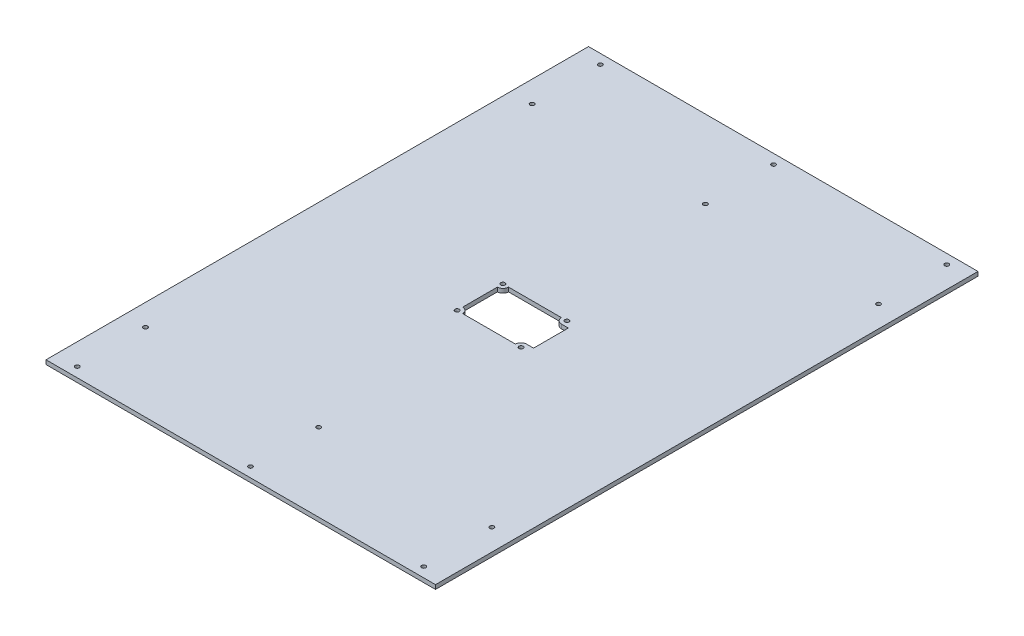
ISO-10303-21;
HEADER;
FILE_DESCRIPTION(('STEP AP214'),'2;1');
FILE_NAME('part.step','',(''),(''),'','','');
FILE_SCHEMA(('AUTOMOTIVE_DESIGN { 1 0 10303 214 1 1 1 1 }'));
ENDSEC;
DATA;
#1=APPLICATION_CONTEXT('core data for automotive mechanical design processes');
#2=APPLICATION_PROTOCOL_DEFINITION('international standard','automotive_design',2000,#1);
#3=PRODUCT_CONTEXT('',#1,'mechanical');
#4=PRODUCT('Part','Part','',(#3));
#5=PRODUCT_RELATED_PRODUCT_CATEGORY('part','',(#4));
#6=PRODUCT_DEFINITION_FORMATION('','',#4);
#7=PRODUCT_DEFINITION_CONTEXT('part definition',#1,'design');
#8=PRODUCT_DEFINITION('design','',#6,#7);
#9=PRODUCT_DEFINITION_SHAPE('','',#8);
#10=(LENGTH_UNIT() NAMED_UNIT(*) SI_UNIT(.MILLI.,.METRE.));
#11=(NAMED_UNIT(*) PLANE_ANGLE_UNIT() SI_UNIT($,.RADIAN.));
#12=(NAMED_UNIT(*) SI_UNIT($,.STERADIAN.) SOLID_ANGLE_UNIT());
#13=UNCERTAINTY_MEASURE_WITH_UNIT(LENGTH_MEASURE(1.E-05),#10,'distance_accuracy_value','');
#14=(GEOMETRIC_REPRESENTATION_CONTEXT(3) GLOBAL_UNCERTAINTY_ASSIGNED_CONTEXT((#13)) GLOBAL_UNIT_ASSIGNED_CONTEXT((#10,
#11,#12)) REPRESENTATION_CONTEXT('',''));
#15=CARTESIAN_POINT('',(0.,0.,0.));
#16=DIRECTION('',(0.,0.,1.));
#17=DIRECTION('',(1.,0.,0.));
#18=AXIS2_PLACEMENT_3D('',#15,#16,#17);
#19=CARTESIAN_POINT('',(0.,3.,0.));
#20=DIRECTION('',(1.,0.,0.));
#21=DIRECTION('',(0.,0.,-1.));
#22=AXIS2_PLACEMENT_3D('',#19,#20,#21);
#23=PLANE('',#22);
#24=DIRECTION('',(0.,0.,1.));
#25=VECTOR('',#24,1.);
#26=CARTESIAN_POINT('',(0.,0.,0.));
#27=LINE('',#26,#25);
#28=CARTESIAN_POINT('',(0.,0.,-390.));
#29=VERTEX_POINT('',#28);
#30=CARTESIAN_POINT('',(0.,0.,0.));
#31=VERTEX_POINT('',#30);
#32=EDGE_CURVE('E315',#29,#31,#27,.T.);
#33=ORIENTED_EDGE('',*,*,#32,.T.);
#34=DIRECTION('',(0.,-1.,0.));
#35=VECTOR('',#34,1.);
#36=CARTESIAN_POINT('',(0.,3.,0.));
#37=LINE('',#36,#35);
#38=CARTESIAN_POINT('',(0.,3.,0.));
#39=VERTEX_POINT('',#38);
#40=EDGE_CURVE('E11',#39,#31,#37,.T.);
#41=ORIENTED_EDGE('',*,*,#40,.F.);
#42=DIRECTION('',(0.,0.,1.));
#43=VECTOR('',#42,1.);
#44=CARTESIAN_POINT('',(0.,3.,0.));
#45=LINE('',#44,#43);
#46=CARTESIAN_POINT('',(0.,3.,-390.));
#47=VERTEX_POINT('',#46);
#48=EDGE_CURVE('E318',#47,#39,#45,.T.);
#49=ORIENTED_EDGE('',*,*,#48,.F.);
#50=DIRECTION('',(0.,-1.,0.));
#51=VECTOR('',#50,1.);
#52=CARTESIAN_POINT('',(0.,3.,-390.));
#53=LINE('',#52,#51);
#54=EDGE_CURVE('E328',#47,#29,#53,.T.);
#55=ORIENTED_EDGE('',*,*,#54,.T.);
#56=EDGE_LOOP('',(#33,#41,#49,#55));
#57=FACE_BOUND('',#56,.T.);
#58=ADVANCED_FACE('F34',(#57),#23,.F.);
#59=CARTESIAN_POINT('',(0.,3.,0.));
#60=DIRECTION('',(0.,0.,-1.));
#61=DIRECTION('',(-1.,0.,0.));
#62=AXIS2_PLACEMENT_3D('',#59,#60,#61);
#63=PLANE('',#62);
#64=DIRECTION('',(1.,0.,0.));
#65=VECTOR('',#64,1.);
#66=CARTESIAN_POINT('',(0.,0.,0.));
#67=LINE('',#66,#65);
#68=CARTESIAN_POINT('',(280.,0.,0.));
#69=VERTEX_POINT('',#68);
#70=EDGE_CURVE('E331',#31,#69,#67,.T.);
#71=ORIENTED_EDGE('',*,*,#70,.T.);
#72=DIRECTION('',(0.,-1.,0.));
#73=VECTOR('',#72,1.);
#74=CARTESIAN_POINT('',(280.,3.,0.));
#75=LINE('',#74,#73);
#76=CARTESIAN_POINT('',(280.,3.,0.));
#77=VERTEX_POINT('',#76);
#78=EDGE_CURVE('E41',#77,#69,#75,.T.);
#79=ORIENTED_EDGE('',*,*,#78,.F.);
#80=DIRECTION('',(1.,0.,0.));
#81=VECTOR('',#80,1.);
#82=CARTESIAN_POINT('',(0.,3.,0.));
#83=LINE('',#82,#81);
#84=EDGE_CURVE('E321',#39,#77,#83,.T.);
#85=ORIENTED_EDGE('',*,*,#84,.F.);
#86=ORIENTED_EDGE('',*,*,#40,.T.);
#87=EDGE_LOOP('',(#71,#79,#85,#86));
#88=FACE_BOUND('',#87,.T.);
#89=ADVANCED_FACE('F360',(#88),#63,.F.);
#90=CARTESIAN_POINT('',(280.,3.,0.));
#91=DIRECTION('',(-1.,0.,0.));
#92=DIRECTION('',(0.,0.,1.));
#93=AXIS2_PLACEMENT_3D('',#90,#91,#92);
#94=PLANE('',#93);
#95=DIRECTION('',(0.,0.,-1.));
#96=VECTOR('',#95,1.);
#97=CARTESIAN_POINT('',(280.,0.,0.));
#98=LINE('',#97,#96);
#99=CARTESIAN_POINT('',(280.,0.,-390.));
#100=VERTEX_POINT('',#99);
#101=EDGE_CURVE('E333',#69,#100,#98,.T.);
#102=ORIENTED_EDGE('',*,*,#101,.T.);
#103=DIRECTION('',(0.,-1.,0.));
#104=VECTOR('',#103,1.);
#105=CARTESIAN_POINT('',(280.,3.,-390.));
#106=LINE('',#105,#104);
#107=CARTESIAN_POINT('',(280.,3.,-390.));
#108=VERTEX_POINT('',#107);
#109=EDGE_CURVE('E338',#108,#100,#106,.T.);
#110=ORIENTED_EDGE('',*,*,#109,.F.);
#111=DIRECTION('',(0.,0.,-1.));
#112=VECTOR('',#111,1.);
#113=CARTESIAN_POINT('',(280.,3.,0.));
#114=LINE('',#113,#112);
#115=EDGE_CURVE('E324',#77,#108,#114,.T.);
#116=ORIENTED_EDGE('',*,*,#115,.F.);
#117=ORIENTED_EDGE('',*,*,#78,.T.);
#118=EDGE_LOOP('',(#102,#110,#116,#117));
#119=FACE_BOUND('',#118,.T.);
#120=ADVANCED_FACE('F345',(#119),#94,.F.);
#121=CARTESIAN_POINT('',(0.,3.,-390.));
#122=DIRECTION('',(0.,0.,1.));
#123=DIRECTION('',(1.,0.,0.));
#124=AXIS2_PLACEMENT_3D('',#121,#122,#123);
#125=PLANE('',#124);
#126=DIRECTION('',(-1.,0.,0.));
#127=VECTOR('',#126,1.);
#128=CARTESIAN_POINT('',(0.,0.,-390.));
#129=LINE('',#128,#127);
#130=EDGE_CURVE('E322',#100,#29,#129,.T.);
#131=ORIENTED_EDGE('',*,*,#130,.T.);
#132=ORIENTED_EDGE('',*,*,#54,.F.);
#133=DIRECTION('',(-1.,0.,0.));
#134=VECTOR('',#133,1.);
#135=CARTESIAN_POINT('',(0.,3.,-390.));
#136=LINE('',#135,#134);
#137=EDGE_CURVE('E326',#108,#47,#136,.T.);
#138=ORIENTED_EDGE('',*,*,#137,.F.);
#139=ORIENTED_EDGE('',*,*,#109,.T.);
#140=EDGE_LOOP('',(#131,#132,#138,#139));
#141=FACE_BOUND('',#140,.T.);
#142=ADVANCED_FACE('F353',(#141),#125,.F.);
#143=CARTESIAN_POINT('',(0.,3.,0.));
#144=DIRECTION('',(0.,-1.,0.));
#145=DIRECTION('',(0.,0.,-1.));
#146=AXIS2_PLACEMENT_3D('',#143,#144,#145);
#147=PLANE('',#146);
#148=CARTESIAN_POINT('',(163.,3.,-211.5));
#149=DIRECTION('',(0.,-1.,0.));
#150=DIRECTION('',(0.,0.,1.));
#151=AXIS2_PLACEMENT_3D('',#148,#149,#150);
#152=CIRCLE('',#151,4.);
#153=CARTESIAN_POINT('',(163.,3.,-207.5));
#154=VERTEX_POINT('',#153);
#155=CARTESIAN_POINT('',(159.,3.,-211.5));
#156=VERTEX_POINT('',#155);
#157=EDGE_CURVE('E48',#154,#156,#152,.T.);
#158=ORIENTED_EDGE('',*,*,#157,.F.);
#159=DIRECTION('',(-1.,0.,0.));
#160=VECTOR('',#159,1.);
#161=CARTESIAN_POINT('',(163.,3.,-207.5));
#162=LINE('',#161,#160);
#163=CARTESIAN_POINT('',(168.,3.,-207.5));
#164=VERTEX_POINT('',#163);
#165=EDGE_CURVE('E161',#164,#154,#162,.T.);
#166=ORIENTED_EDGE('',*,*,#165,.F.);
#167=DIRECTION('',(0.,0.,-1.));
#168=VECTOR('',#167,1.);
#169=CARTESIAN_POINT('',(168.,3.,-207.5));
#170=LINE('',#169,#168);
#171=CARTESIAN_POINT('',(168.,3.,-182.5));
#172=VERTEX_POINT('',#171);
#173=EDGE_CURVE('E163',#172,#164,#170,.T.);
#174=ORIENTED_EDGE('',*,*,#173,.F.);
#175=DIRECTION('',(1.,0.,0.));
#176=VECTOR('',#175,1.);
#177=CARTESIAN_POINT('',(163.,3.,-182.5));
#178=LINE('',#177,#176);
#179=CARTESIAN_POINT('',(163.,3.,-182.5));
#180=VERTEX_POINT('',#179);
#181=EDGE_CURVE('E141',#180,#172,#178,.T.);
#182=ORIENTED_EDGE('',*,*,#181,.F.);
#183=CARTESIAN_POINT('',(163.,3.,-178.5));
#184=DIRECTION('',(0.,-1.,0.));
#185=DIRECTION('',(0.,0.,1.));
#186=AXIS2_PLACEMENT_3D('',#183,#184,#185);
#187=CIRCLE('',#186,4.);
#188=CARTESIAN_POINT('',(159.,3.,-178.5));
#189=VERTEX_POINT('',#188);
#190=EDGE_CURVE('E174',#189,#180,#187,.T.);
#191=ORIENTED_EDGE('',*,*,#190,.F.);
#192=DIRECTION('',(1.,0.,0.));
#193=VECTOR('',#192,1.);
#194=CARTESIAN_POINT('',(159.,3.,-178.5));
#195=LINE('',#194,#193);
#196=CARTESIAN_POINT('',(121.,3.,-178.5));
#197=VERTEX_POINT('',#196);
#198=EDGE_CURVE('E201',#197,#189,#195,.T.);
#199=ORIENTED_EDGE('',*,*,#198,.F.);
#200=CARTESIAN_POINT('',(117.,3.,-178.5));
#201=DIRECTION('',(0.,-1.,0.));
#202=DIRECTION('',(0.,0.,1.));
#203=AXIS2_PLACEMENT_3D('',#200,#201,#202);
#204=CIRCLE('',#203,4.);
#205=CARTESIAN_POINT('',(117.,3.,-182.5));
#206=VERTEX_POINT('',#205);
#207=EDGE_CURVE('E198',#206,#197,#204,.T.);
#208=ORIENTED_EDGE('',*,*,#207,.F.);
#209=DIRECTION('',(0.,0.,1.));
#210=VECTOR('',#209,1.);
#211=CARTESIAN_POINT('',(117.,3.,-182.5));
#212=LINE('',#211,#210);
#213=CARTESIAN_POINT('',(117.,3.,-207.5));
#214=VERTEX_POINT('',#213);
#215=EDGE_CURVE('E195',#214,#206,#212,.T.);
#216=ORIENTED_EDGE('',*,*,#215,.F.);
#217=CARTESIAN_POINT('',(117.,3.,-211.5));
#218=DIRECTION('',(0.,-1.,0.));
#219=DIRECTION('',(0.,0.,1.));
#220=AXIS2_PLACEMENT_3D('',#217,#218,#219);
#221=CIRCLE('',#220,4.);
#222=CARTESIAN_POINT('',(121.,3.,-211.5));
#223=VERTEX_POINT('',#222);
#224=EDGE_CURVE('E192',#223,#214,#221,.T.);
#225=ORIENTED_EDGE('',*,*,#224,.F.);
#226=DIRECTION('',(-1.,0.,0.));
#227=VECTOR('',#226,1.);
#228=CARTESIAN_POINT('',(121.,3.,-211.5));
#229=LINE('',#228,#227);
#230=EDGE_CURVE('E189',#156,#223,#229,.T.);
#231=ORIENTED_EDGE('',*,*,#230,.F.);
#232=EDGE_LOOP('',(#158,#166,#174,#182,#191,#199,#208,#216,#225,#231));
#233=FACE_BOUND('',#232,.T.);
#234=CARTESIAN_POINT('',(117.,3.,-178.5));
#235=DIRECTION('',(0.,1.,0.));
#236=DIRECTION('',(0.,0.,1.));
#237=AXIS2_PLACEMENT_3D('',#234,#235,#236);
#238=CIRCLE('',#237,1.49999999999998);
#239=CARTESIAN_POINT('',(117.,3.,-177.));
#240=VERTEX_POINT('',#239);
#241=EDGE_CURVE('E208',#240,#240,#238,.T.);
#242=ORIENTED_EDGE('',*,*,#241,.F.);
#243=EDGE_LOOP('',(#242));
#244=FACE_BOUND('',#243,.T.);
#245=CARTESIAN_POINT('',(163.,3.,-178.5));
#246=DIRECTION('',(0.,1.,0.));
#247=DIRECTION('',(0.,0.,1.));
#248=AXIS2_PLACEMENT_3D('',#245,#246,#247);
#249=CIRCLE('',#248,1.5);
#250=CARTESIAN_POINT('',(163.,3.,-177.));
#251=VERTEX_POINT('',#250);
#252=EDGE_CURVE('E225',#251,#251,#249,.T.);
#253=ORIENTED_EDGE('',*,*,#252,.F.);
#254=EDGE_LOOP('',(#253));
#255=FACE_BOUND('',#254,.T.);
#256=CARTESIAN_POINT('',(163.,3.,-211.5));
#257=DIRECTION('',(0.,1.,0.));
#258=DIRECTION('',(0.,0.,1.));
#259=AXIS2_PLACEMENT_3D('',#256,#257,#258);
#260=CIRCLE('',#259,1.5);
#261=CARTESIAN_POINT('',(163.,3.,-210.));
#262=VERTEX_POINT('',#261);
#263=EDGE_CURVE('E231',#262,#262,#260,.T.);
#264=ORIENTED_EDGE('',*,*,#263,.F.);
#265=EDGE_LOOP('',(#264));
#266=FACE_BOUND('',#265,.T.);
#267=CARTESIAN_POINT('',(117.,3.,-211.5));
#268=DIRECTION('',(0.,1.,0.));
#269=DIRECTION('',(0.,0.,1.));
#270=AXIS2_PLACEMENT_3D('',#267,#268,#269);
#271=CIRCLE('',#270,1.49999999999998);
#272=CARTESIAN_POINT('',(117.,3.,-210.));
#273=VERTEX_POINT('',#272);
#274=EDGE_CURVE('E237',#273,#273,#271,.T.);
#275=ORIENTED_EDGE('',*,*,#274,.F.);
#276=EDGE_LOOP('',(#275));
#277=FACE_BOUND('',#276,.T.);
#278=CARTESIAN_POINT('',(15.5,3.,-6.99999999999995));
#279=DIRECTION('',(0.,1.,0.));
#280=DIRECTION('',(0.,0.,1.));
#281=AXIS2_PLACEMENT_3D('',#278,#279,#280);
#282=CIRCLE('',#281,1.50000000000002);
#283=CARTESIAN_POINT('',(15.5,3.,-5.49999999999993));
#284=VERTEX_POINT('',#283);
#285=EDGE_CURVE('E243',#284,#284,#282,.T.);
#286=ORIENTED_EDGE('',*,*,#285,.F.);
#287=EDGE_LOOP('',(#286));
#288=FACE_BOUND('',#287,.T.);
#289=CARTESIAN_POINT('',(15.5,3.,-55.9999999999999));
#290=DIRECTION('',(0.,1.,0.));
#291=DIRECTION('',(0.,0.,1.));
#292=AXIS2_PLACEMENT_3D('',#289,#290,#291);
#293=CIRCLE('',#292,1.50000000000002);
#294=CARTESIAN_POINT('',(15.5,3.,-54.4999999999999));
#295=VERTEX_POINT('',#294);
#296=EDGE_CURVE('E249',#295,#295,#293,.T.);
#297=ORIENTED_EDGE('',*,*,#296,.F.);
#298=EDGE_LOOP('',(#297));
#299=FACE_BOUND('',#298,.T.);
#300=CARTESIAN_POINT('',(140.,3.,-55.9999999999999));
#301=DIRECTION('',(0.,1.,0.));
#302=DIRECTION('',(0.,0.,-1.));
#303=AXIS2_PLACEMENT_3D('',#300,#301,#302);
#304=CIRCLE('',#303,1.5);
#305=CARTESIAN_POINT('',(140.,3.,-57.4999999999999));
#306=VERTEX_POINT('',#305);
#307=EDGE_CURVE('E255',#306,#306,#304,.T.);
#308=ORIENTED_EDGE('',*,*,#307,.F.);
#309=EDGE_LOOP('',(#308));
#310=FACE_BOUND('',#309,.T.);
#311=CARTESIAN_POINT('',(140.,3.,-6.99999999999995));
#312=DIRECTION('',(0.,1.,0.));
#313=DIRECTION('',(0.,0.,-1.));
#314=AXIS2_PLACEMENT_3D('',#311,#312,#313);
#315=CIRCLE('',#314,1.5);
#316=CARTESIAN_POINT('',(140.,3.,-8.49999999999995));
#317=VERTEX_POINT('',#316);
#318=EDGE_CURVE('E261',#317,#317,#315,.T.);
#319=ORIENTED_EDGE('',*,*,#318,.F.);
#320=EDGE_LOOP('',(#319));
#321=FACE_BOUND('',#320,.T.);
#322=CARTESIAN_POINT('',(264.5,3.,-6.99999999999995));
#323=DIRECTION('',(0.,1.,0.));
#324=DIRECTION('',(0.,0.,-1.));
#325=AXIS2_PLACEMENT_3D('',#322,#323,#324);
#326=CIRCLE('',#325,1.50000000000002);
#327=CARTESIAN_POINT('',(264.5,3.,-8.49999999999998));
#328=VERTEX_POINT('',#327);
#329=EDGE_CURVE('E267',#328,#328,#326,.T.);
#330=ORIENTED_EDGE('',*,*,#329,.F.);
#331=EDGE_LOOP('',(#330));
#332=FACE_BOUND('',#331,.T.);
#333=CARTESIAN_POINT('',(264.5,3.,-55.9999999999999));
#334=DIRECTION('',(0.,1.,0.));
#335=DIRECTION('',(0.,0.,-1.));
#336=AXIS2_PLACEMENT_3D('',#333,#334,#335);
#337=CIRCLE('',#336,1.50000000000002);
#338=CARTESIAN_POINT('',(264.5,3.,-57.5));
#339=VERTEX_POINT('',#338);
#340=EDGE_CURVE('E273',#339,#339,#337,.T.);
#341=ORIENTED_EDGE('',*,*,#340,.F.);
#342=EDGE_LOOP('',(#341));
#343=FACE_BOUND('',#342,.T.);
#344=CARTESIAN_POINT('',(15.5,3.,-334.));
#345=DIRECTION('',(0.,1.,0.));
#346=DIRECTION('',(0.,0.,-1.));
#347=AXIS2_PLACEMENT_3D('',#344,#345,#346);
#348=CIRCLE('',#347,1.50000000000002);
#349=CARTESIAN_POINT('',(15.5,3.,-335.5));
#350=VERTEX_POINT('',#349);
#351=EDGE_CURVE('E279',#350,#350,#348,.T.);
#352=ORIENTED_EDGE('',*,*,#351,.F.);
#353=EDGE_LOOP('',(#352));
#354=FACE_BOUND('',#353,.T.);
#355=CARTESIAN_POINT('',(15.5,3.,-383.));
#356=DIRECTION('',(0.,1.,0.));
#357=DIRECTION('',(0.,0.,-1.));
#358=AXIS2_PLACEMENT_3D('',#355,#356,#357);
#359=CIRCLE('',#358,1.50000000000002);
#360=CARTESIAN_POINT('',(15.5,3.,-384.5));
#361=VERTEX_POINT('',#360);
#362=EDGE_CURVE('E285',#361,#361,#359,.T.);
#363=ORIENTED_EDGE('',*,*,#362,.F.);
#364=EDGE_LOOP('',(#363));
#365=FACE_BOUND('',#364,.T.);
#366=CARTESIAN_POINT('',(264.5,3.,-334.));
#367=DIRECTION('',(0.,1.,0.));
#368=DIRECTION('',(0.,0.,1.));
#369=AXIS2_PLACEMENT_3D('',#366,#367,#368);
#370=CIRCLE('',#369,1.50000000000002);
#371=CARTESIAN_POINT('',(264.5,3.,-332.5));
#372=VERTEX_POINT('',#371);
#373=EDGE_CURVE('E291',#372,#372,#370,.T.);
#374=ORIENTED_EDGE('',*,*,#373,.F.);
#375=EDGE_LOOP('',(#374));
#376=FACE_BOUND('',#375,.T.);
#377=CARTESIAN_POINT('',(264.5,3.,-383.));
#378=DIRECTION('',(0.,1.,0.));
#379=DIRECTION('',(0.,0.,1.));
#380=AXIS2_PLACEMENT_3D('',#377,#378,#379);
#381=CIRCLE('',#380,1.50000000000002);
#382=CARTESIAN_POINT('',(264.5,3.,-381.5));
#383=VERTEX_POINT('',#382);
#384=EDGE_CURVE('E297',#383,#383,#381,.T.);
#385=ORIENTED_EDGE('',*,*,#384,.F.);
#386=EDGE_LOOP('',(#385));
#387=FACE_BOUND('',#386,.T.);
#388=CARTESIAN_POINT('',(140.,3.,-334.));
#389=DIRECTION('',(0.,1.,0.));
#390=DIRECTION('',(0.,0.,1.));
#391=AXIS2_PLACEMENT_3D('',#388,#389,#390);
#392=CIRCLE('',#391,1.5);
#393=CARTESIAN_POINT('',(140.,3.,-332.5));
#394=VERTEX_POINT('',#393);
#395=EDGE_CURVE('E303',#394,#394,#392,.T.);
#396=ORIENTED_EDGE('',*,*,#395,.F.);
#397=EDGE_LOOP('',(#396));
#398=FACE_BOUND('',#397,.T.);
#399=CARTESIAN_POINT('',(140.,3.,-383.));
#400=DIRECTION('',(0.,1.,0.));
#401=DIRECTION('',(0.,0.,1.));
#402=AXIS2_PLACEMENT_3D('',#399,#400,#401);
#403=CIRCLE('',#402,1.5);
#404=CARTESIAN_POINT('',(140.,3.,-381.5));
#405=VERTEX_POINT('',#404);
#406=EDGE_CURVE('E309',#405,#405,#403,.T.);
#407=ORIENTED_EDGE('',*,*,#406,.F.);
#408=EDGE_LOOP('',(#407));
#409=FACE_BOUND('',#408,.T.);
#410=ORIENTED_EDGE('',*,*,#48,.T.);
#411=ORIENTED_EDGE('',*,*,#84,.T.);
#412=ORIENTED_EDGE('',*,*,#115,.T.);
#413=ORIENTED_EDGE('',*,*,#137,.T.);
#414=EDGE_LOOP('',(#410,#411,#412,#413));
#415=FACE_BOUND('',#414,.T.);
#416=ADVANCED_FACE('F359',(#233,#244,#255,#266,#277,#288,#299,#310,#321,#332,#343,#354,#365,
#376,#387,#398,#409,#415),#147,.F.);
#417=CARTESIAN_POINT('',(0.,0.,0.));
#418=DIRECTION('',(0.,-1.,0.));
#419=DIRECTION('',(0.,0.,-1.));
#420=AXIS2_PLACEMENT_3D('',#417,#418,#419);
#421=PLANE('',#420);
#422=DIRECTION('',(-1.,0.,0.));
#423=VECTOR('',#422,1.);
#424=CARTESIAN_POINT('',(163.,0.,-207.5));
#425=LINE('',#424,#423);
#426=CARTESIAN_POINT('',(168.,0.,-207.5));
#427=VERTEX_POINT('',#426);
#428=CARTESIAN_POINT('',(163.,0.,-207.5));
#429=VERTEX_POINT('',#428);
#430=EDGE_CURVE('E146',#427,#429,#425,.T.);
#431=ORIENTED_EDGE('',*,*,#430,.T.);
#432=CARTESIAN_POINT('',(163.,0.,-211.5));
#433=DIRECTION('',(0.,-1.,0.));
#434=DIRECTION('',(0.,0.,1.));
#435=AXIS2_PLACEMENT_3D('',#432,#433,#434);
#436=CIRCLE('',#435,4.);
#437=CARTESIAN_POINT('',(159.,0.,-211.5));
#438=VERTEX_POINT('',#437);
#439=EDGE_CURVE('E170',#429,#438,#436,.T.);
#440=ORIENTED_EDGE('',*,*,#439,.T.);
#441=DIRECTION('',(-1.,0.,0.));
#442=VECTOR('',#441,1.);
#443=CARTESIAN_POINT('',(121.,0.,-211.5));
#444=LINE('',#443,#442);
#445=CARTESIAN_POINT('',(121.,0.,-211.5));
#446=VERTEX_POINT('',#445);
#447=EDGE_CURVE('E173',#438,#446,#444,.T.);
#448=ORIENTED_EDGE('',*,*,#447,.T.);
#449=CARTESIAN_POINT('',(117.,0.,-211.5));
#450=DIRECTION('',(0.,-1.,0.));
#451=DIRECTION('',(0.,0.,1.));
#452=AXIS2_PLACEMENT_3D('',#449,#450,#451);
#453=CIRCLE('',#452,4.);
#454=CARTESIAN_POINT('',(117.,0.,-207.5));
#455=VERTEX_POINT('',#454);
#456=EDGE_CURVE('E56',#446,#455,#453,.T.);
#457=ORIENTED_EDGE('',*,*,#456,.T.);
#458=DIRECTION('',(0.,0.,1.));
#459=VECTOR('',#458,1.);
#460=CARTESIAN_POINT('',(117.,0.,-182.5));
#461=LINE('',#460,#459);
#462=CARTESIAN_POINT('',(117.,0.,-182.5));
#463=VERTEX_POINT('',#462);
#464=EDGE_CURVE('E178',#455,#463,#461,.T.);
#465=ORIENTED_EDGE('',*,*,#464,.T.);
#466=CARTESIAN_POINT('',(117.,0.,-178.5));
#467=DIRECTION('',(0.,-1.,0.));
#468=DIRECTION('',(0.,0.,1.));
#469=AXIS2_PLACEMENT_3D('',#466,#467,#468);
#470=CIRCLE('',#469,4.);
#471=CARTESIAN_POINT('',(121.,0.,-178.5));
#472=VERTEX_POINT('',#471);
#473=EDGE_CURVE('E181',#463,#472,#470,.T.);
#474=ORIENTED_EDGE('',*,*,#473,.T.);
#475=DIRECTION('',(1.,0.,0.));
#476=VECTOR('',#475,1.);
#477=CARTESIAN_POINT('',(159.,0.,-178.5));
#478=LINE('',#477,#476);
#479=CARTESIAN_POINT('',(159.,0.,-178.5));
#480=VERTEX_POINT('',#479);
#481=EDGE_CURVE('E184',#472,#480,#478,.T.);
#482=ORIENTED_EDGE('',*,*,#481,.T.);
#483=CARTESIAN_POINT('',(163.,0.,-178.5));
#484=DIRECTION('',(0.,-1.,0.));
#485=DIRECTION('',(0.,0.,1.));
#486=AXIS2_PLACEMENT_3D('',#483,#484,#485);
#487=CIRCLE('',#486,4.);
#488=CARTESIAN_POINT('',(163.,0.,-182.5));
#489=VERTEX_POINT('',#488);
#490=EDGE_CURVE('E160',#480,#489,#487,.T.);
#491=ORIENTED_EDGE('',*,*,#490,.T.);
#492=DIRECTION('',(1.,0.,0.));
#493=VECTOR('',#492,1.);
#494=CARTESIAN_POINT('',(163.,0.,-182.5));
#495=LINE('',#494,#493);
#496=CARTESIAN_POINT('',(168.,0.,-182.5));
#497=VERTEX_POINT('',#496);
#498=EDGE_CURVE('E138',#489,#497,#495,.T.);
#499=ORIENTED_EDGE('',*,*,#498,.T.);
#500=DIRECTION('',(0.,0.,-1.));
#501=VECTOR('',#500,1.);
#502=CARTESIAN_POINT('',(168.,0.,-207.5));
#503=LINE('',#502,#501);
#504=EDGE_CURVE('E149',#497,#427,#503,.T.);
#505=ORIENTED_EDGE('',*,*,#504,.T.);
#506=EDGE_LOOP('',(#431,#440,#448,#457,#465,#474,#482,#491,#499,#505));
#507=FACE_BOUND('',#506,.T.);
#508=CARTESIAN_POINT('',(117.,0.,-178.5));
#509=DIRECTION('',(0.,1.,0.));
#510=DIRECTION('',(0.,0.,1.));
#511=AXIS2_PLACEMENT_3D('',#508,#509,#510);
#512=CIRCLE('',#511,1.49999999999998);
#513=CARTESIAN_POINT('',(117.,0.,-177.));
#514=VERTEX_POINT('',#513);
#515=EDGE_CURVE('E222',#514,#514,#512,.T.);
#516=ORIENTED_EDGE('',*,*,#515,.T.);
#517=EDGE_LOOP('',(#516));
#518=FACE_BOUND('',#517,.T.);
#519=CARTESIAN_POINT('',(163.,0.,-178.5));
#520=DIRECTION('',(0.,1.,0.));
#521=DIRECTION('',(0.,0.,1.));
#522=AXIS2_PLACEMENT_3D('',#519,#520,#521);
#523=CIRCLE('',#522,1.5);
#524=CARTESIAN_POINT('',(163.,0.,-177.));
#525=VERTEX_POINT('',#524);
#526=EDGE_CURVE('E228',#525,#525,#523,.T.);
#527=ORIENTED_EDGE('',*,*,#526,.T.);
#528=EDGE_LOOP('',(#527));
#529=FACE_BOUND('',#528,.T.);
#530=CARTESIAN_POINT('',(163.,0.,-211.5));
#531=DIRECTION('',(0.,1.,0.));
#532=DIRECTION('',(0.,0.,1.));
#533=AXIS2_PLACEMENT_3D('',#530,#531,#532);
#534=CIRCLE('',#533,1.5);
#535=CARTESIAN_POINT('',(163.,0.,-210.));
#536=VERTEX_POINT('',#535);
#537=EDGE_CURVE('E234',#536,#536,#534,.T.);
#538=ORIENTED_EDGE('',*,*,#537,.T.);
#539=EDGE_LOOP('',(#538));
#540=FACE_BOUND('',#539,.T.);
#541=CARTESIAN_POINT('',(117.,0.,-211.5));
#542=DIRECTION('',(0.,1.,0.));
#543=DIRECTION('',(0.,0.,1.));
#544=AXIS2_PLACEMENT_3D('',#541,#542,#543);
#545=CIRCLE('',#544,1.49999999999998);
#546=CARTESIAN_POINT('',(117.,0.,-210.));
#547=VERTEX_POINT('',#546);
#548=EDGE_CURVE('E240',#547,#547,#545,.T.);
#549=ORIENTED_EDGE('',*,*,#548,.T.);
#550=EDGE_LOOP('',(#549));
#551=FACE_BOUND('',#550,.T.);
#552=CARTESIAN_POINT('',(15.5,0.,-6.99999999999995));
#553=DIRECTION('',(0.,1.,0.));
#554=DIRECTION('',(0.,0.,1.));
#555=AXIS2_PLACEMENT_3D('',#552,#553,#554);
#556=CIRCLE('',#555,1.50000000000002);
#557=CARTESIAN_POINT('',(15.5,0.,-5.49999999999993));
#558=VERTEX_POINT('',#557);
#559=EDGE_CURVE('E246',#558,#558,#556,.T.);
#560=ORIENTED_EDGE('',*,*,#559,.T.);
#561=EDGE_LOOP('',(#560));
#562=FACE_BOUND('',#561,.T.);
#563=CARTESIAN_POINT('',(15.5,0.,-55.9999999999999));
#564=DIRECTION('',(0.,1.,0.));
#565=DIRECTION('',(0.,0.,1.));
#566=AXIS2_PLACEMENT_3D('',#563,#564,#565);
#567=CIRCLE('',#566,1.50000000000002);
#568=CARTESIAN_POINT('',(15.5,0.,-54.4999999999999));
#569=VERTEX_POINT('',#568);
#570=EDGE_CURVE('E252',#569,#569,#567,.T.);
#571=ORIENTED_EDGE('',*,*,#570,.T.);
#572=EDGE_LOOP('',(#571));
#573=FACE_BOUND('',#572,.T.);
#574=CARTESIAN_POINT('',(140.,0.,-55.9999999999999));
#575=DIRECTION('',(0.,1.,0.));
#576=DIRECTION('',(0.,0.,-1.));
#577=AXIS2_PLACEMENT_3D('',#574,#575,#576);
#578=CIRCLE('',#577,1.5);
#579=CARTESIAN_POINT('',(140.,0.,-57.4999999999999));
#580=VERTEX_POINT('',#579);
#581=EDGE_CURVE('E258',#580,#580,#578,.T.);
#582=ORIENTED_EDGE('',*,*,#581,.T.);
#583=EDGE_LOOP('',(#582));
#584=FACE_BOUND('',#583,.T.);
#585=CARTESIAN_POINT('',(140.,0.,-6.99999999999995));
#586=DIRECTION('',(0.,1.,0.));
#587=DIRECTION('',(0.,0.,-1.));
#588=AXIS2_PLACEMENT_3D('',#585,#586,#587);
#589=CIRCLE('',#588,1.5);
#590=CARTESIAN_POINT('',(140.,0.,-8.49999999999995));
#591=VERTEX_POINT('',#590);
#592=EDGE_CURVE('E264',#591,#591,#589,.T.);
#593=ORIENTED_EDGE('',*,*,#592,.T.);
#594=EDGE_LOOP('',(#593));
#595=FACE_BOUND('',#594,.T.);
#596=CARTESIAN_POINT('',(264.5,0.,-6.99999999999995));
#597=DIRECTION('',(0.,1.,0.));
#598=DIRECTION('',(0.,0.,-1.));
#599=AXIS2_PLACEMENT_3D('',#596,#597,#598);
#600=CIRCLE('',#599,1.50000000000002);
#601=CARTESIAN_POINT('',(264.5,0.,-8.49999999999998));
#602=VERTEX_POINT('',#601);
#603=EDGE_CURVE('E270',#602,#602,#600,.T.);
#604=ORIENTED_EDGE('',*,*,#603,.T.);
#605=EDGE_LOOP('',(#604));
#606=FACE_BOUND('',#605,.T.);
#607=CARTESIAN_POINT('',(264.5,0.,-55.9999999999999));
#608=DIRECTION('',(0.,1.,0.));
#609=DIRECTION('',(0.,0.,-1.));
#610=AXIS2_PLACEMENT_3D('',#607,#608,#609);
#611=CIRCLE('',#610,1.50000000000002);
#612=CARTESIAN_POINT('',(264.5,0.,-57.5));
#613=VERTEX_POINT('',#612);
#614=EDGE_CURVE('E276',#613,#613,#611,.T.);
#615=ORIENTED_EDGE('',*,*,#614,.T.);
#616=EDGE_LOOP('',(#615));
#617=FACE_BOUND('',#616,.T.);
#618=CARTESIAN_POINT('',(15.5,0.,-334.));
#619=DIRECTION('',(0.,1.,0.));
#620=DIRECTION('',(0.,0.,-1.));
#621=AXIS2_PLACEMENT_3D('',#618,#619,#620);
#622=CIRCLE('',#621,1.50000000000002);
#623=CARTESIAN_POINT('',(15.5,0.,-335.5));
#624=VERTEX_POINT('',#623);
#625=EDGE_CURVE('E282',#624,#624,#622,.T.);
#626=ORIENTED_EDGE('',*,*,#625,.T.);
#627=EDGE_LOOP('',(#626));
#628=FACE_BOUND('',#627,.T.);
#629=CARTESIAN_POINT('',(15.5,0.,-383.));
#630=DIRECTION('',(0.,1.,0.));
#631=DIRECTION('',(0.,0.,-1.));
#632=AXIS2_PLACEMENT_3D('',#629,#630,#631);
#633=CIRCLE('',#632,1.50000000000002);
#634=CARTESIAN_POINT('',(15.5,0.,-384.5));
#635=VERTEX_POINT('',#634);
#636=EDGE_CURVE('E288',#635,#635,#633,.T.);
#637=ORIENTED_EDGE('',*,*,#636,.T.);
#638=EDGE_LOOP('',(#637));
#639=FACE_BOUND('',#638,.T.);
#640=CARTESIAN_POINT('',(264.5,0.,-334.));
#641=DIRECTION('',(0.,1.,0.));
#642=DIRECTION('',(0.,0.,1.));
#643=AXIS2_PLACEMENT_3D('',#640,#641,#642);
#644=CIRCLE('',#643,1.50000000000002);
#645=CARTESIAN_POINT('',(264.5,0.,-332.5));
#646=VERTEX_POINT('',#645);
#647=EDGE_CURVE('E294',#646,#646,#644,.T.);
#648=ORIENTED_EDGE('',*,*,#647,.T.);
#649=EDGE_LOOP('',(#648));
#650=FACE_BOUND('',#649,.T.);
#651=CARTESIAN_POINT('',(264.5,0.,-383.));
#652=DIRECTION('',(0.,1.,0.));
#653=DIRECTION('',(0.,0.,1.));
#654=AXIS2_PLACEMENT_3D('',#651,#652,#653);
#655=CIRCLE('',#654,1.50000000000002);
#656=CARTESIAN_POINT('',(264.5,0.,-381.5));
#657=VERTEX_POINT('',#656);
#658=EDGE_CURVE('E300',#657,#657,#655,.T.);
#659=ORIENTED_EDGE('',*,*,#658,.T.);
#660=EDGE_LOOP('',(#659));
#661=FACE_BOUND('',#660,.T.);
#662=CARTESIAN_POINT('',(140.,0.,-334.));
#663=DIRECTION('',(0.,1.,0.));
#664=DIRECTION('',(0.,0.,1.));
#665=AXIS2_PLACEMENT_3D('',#662,#663,#664);
#666=CIRCLE('',#665,1.5);
#667=CARTESIAN_POINT('',(140.,0.,-332.5));
#668=VERTEX_POINT('',#667);
#669=EDGE_CURVE('E306',#668,#668,#666,.T.);
#670=ORIENTED_EDGE('',*,*,#669,.T.);
#671=EDGE_LOOP('',(#670));
#672=FACE_BOUND('',#671,.T.);
#673=CARTESIAN_POINT('',(140.,0.,-383.));
#674=DIRECTION('',(0.,1.,0.));
#675=DIRECTION('',(0.,0.,1.));
#676=AXIS2_PLACEMENT_3D('',#673,#674,#675);
#677=CIRCLE('',#676,1.5);
#678=CARTESIAN_POINT('',(140.,0.,-381.5));
#679=VERTEX_POINT('',#678);
#680=EDGE_CURVE('E312',#679,#679,#677,.T.);
#681=ORIENTED_EDGE('',*,*,#680,.T.);
#682=EDGE_LOOP('',(#681));
#683=FACE_BOUND('',#682,.T.);
#684=ORIENTED_EDGE('',*,*,#32,.F.);
#685=ORIENTED_EDGE('',*,*,#130,.F.);
#686=ORIENTED_EDGE('',*,*,#101,.F.);
#687=ORIENTED_EDGE('',*,*,#70,.F.);
#688=EDGE_LOOP('',(#684,#685,#686,#687));
#689=FACE_BOUND('',#688,.T.);
#690=ADVANCED_FACE('F156',(#507,#518,#529,#540,#551,#562,#573,#584,#595,#606,#617,#628,#639,
#650,#661,#672,#683,#689),#421,.T.);
#691=CARTESIAN_POINT('',(140.,0.,-383.));
#692=DIRECTION('',(0.,1.,0.));
#693=DIRECTION('',(0.,0.,1.));
#694=AXIS2_PLACEMENT_3D('',#691,#692,#693);
#695=CYLINDRICAL_SURFACE('',#694,1.5);
#696=ORIENTED_EDGE('',*,*,#680,.F.);
#697=EDGE_LOOP('',(#696));
#698=FACE_BOUND('',#697,.T.);
#699=ORIENTED_EDGE('',*,*,#406,.T.);
#700=EDGE_LOOP('',(#699));
#701=FACE_BOUND('',#700,.T.);
#702=ADVANCED_FACE('F372',(#698,#701),#695,.F.);
#703=CARTESIAN_POINT('',(140.,0.,-334.));
#704=DIRECTION('',(0.,1.,0.));
#705=DIRECTION('',(0.,0.,1.));
#706=AXIS2_PLACEMENT_3D('',#703,#704,#705);
#707=CYLINDRICAL_SURFACE('',#706,1.5);
#708=ORIENTED_EDGE('',*,*,#669,.F.);
#709=EDGE_LOOP('',(#708));
#710=FACE_BOUND('',#709,.T.);
#711=ORIENTED_EDGE('',*,*,#395,.T.);
#712=EDGE_LOOP('',(#711));
#713=FACE_BOUND('',#712,.T.);
#714=ADVANCED_FACE('F378',(#710,#713),#707,.F.);
#715=CARTESIAN_POINT('',(264.5,0.,-383.));
#716=DIRECTION('',(0.,1.,0.));
#717=DIRECTION('',(0.,0.,1.));
#718=AXIS2_PLACEMENT_3D('',#715,#716,#717);
#719=CYLINDRICAL_SURFACE('',#718,1.50000000000002);
#720=ORIENTED_EDGE('',*,*,#658,.F.);
#721=EDGE_LOOP('',(#720));
#722=FACE_BOUND('',#721,.T.);
#723=ORIENTED_EDGE('',*,*,#384,.T.);
#724=EDGE_LOOP('',(#723));
#725=FACE_BOUND('',#724,.T.);
#726=ADVANCED_FACE('F382',(#722,#725),#719,.F.);
#727=CARTESIAN_POINT('',(264.5,0.,-334.));
#728=DIRECTION('',(0.,1.,0.));
#729=DIRECTION('',(0.,0.,1.));
#730=AXIS2_PLACEMENT_3D('',#727,#728,#729);
#731=CYLINDRICAL_SURFACE('',#730,1.50000000000002);
#732=ORIENTED_EDGE('',*,*,#647,.F.);
#733=EDGE_LOOP('',(#732));
#734=FACE_BOUND('',#733,.T.);
#735=ORIENTED_EDGE('',*,*,#373,.T.);
#736=EDGE_LOOP('',(#735));
#737=FACE_BOUND('',#736,.T.);
#738=ADVANCED_FACE('F386',(#734,#737),#731,.F.);
#739=CARTESIAN_POINT('',(15.5,0.,-383.));
#740=DIRECTION('',(0.,1.,0.));
#741=DIRECTION('',(0.,0.,1.));
#742=AXIS2_PLACEMENT_3D('',#739,#740,#741);
#743=CYLINDRICAL_SURFACE('',#742,1.50000000000002);
#744=ORIENTED_EDGE('',*,*,#636,.F.);
#745=EDGE_LOOP('',(#744));
#746=FACE_BOUND('',#745,.T.);
#747=ORIENTED_EDGE('',*,*,#362,.T.);
#748=EDGE_LOOP('',(#747));
#749=FACE_BOUND('',#748,.T.);
#750=ADVANCED_FACE('F390',(#746,#749),#743,.F.);
#751=CARTESIAN_POINT('',(15.5,0.,-334.));
#752=DIRECTION('',(0.,1.,0.));
#753=DIRECTION('',(0.,0.,1.));
#754=AXIS2_PLACEMENT_3D('',#751,#752,#753);
#755=CYLINDRICAL_SURFACE('',#754,1.50000000000002);
#756=ORIENTED_EDGE('',*,*,#625,.F.);
#757=EDGE_LOOP('',(#756));
#758=FACE_BOUND('',#757,.T.);
#759=ORIENTED_EDGE('',*,*,#351,.T.);
#760=EDGE_LOOP('',(#759));
#761=FACE_BOUND('',#760,.T.);
#762=ADVANCED_FACE('F394',(#758,#761),#755,.F.);
#763=CARTESIAN_POINT('',(264.5,0.,-55.9999999999999));
#764=DIRECTION('',(0.,1.,0.));
#765=DIRECTION('',(0.,0.,1.));
#766=AXIS2_PLACEMENT_3D('',#763,#764,#765);
#767=CYLINDRICAL_SURFACE('',#766,1.50000000000002);
#768=ORIENTED_EDGE('',*,*,#614,.F.);
#769=EDGE_LOOP('',(#768));
#770=FACE_BOUND('',#769,.T.);
#771=ORIENTED_EDGE('',*,*,#340,.T.);
#772=EDGE_LOOP('',(#771));
#773=FACE_BOUND('',#772,.T.);
#774=ADVANCED_FACE('F398',(#770,#773),#767,.F.);
#775=CARTESIAN_POINT('',(264.5,0.,-6.99999999999995));
#776=DIRECTION('',(0.,1.,0.));
#777=DIRECTION('',(0.,0.,1.));
#778=AXIS2_PLACEMENT_3D('',#775,#776,#777);
#779=CYLINDRICAL_SURFACE('',#778,1.50000000000002);
#780=ORIENTED_EDGE('',*,*,#603,.F.);
#781=EDGE_LOOP('',(#780));
#782=FACE_BOUND('',#781,.T.);
#783=ORIENTED_EDGE('',*,*,#329,.T.);
#784=EDGE_LOOP('',(#783));
#785=FACE_BOUND('',#784,.T.);
#786=ADVANCED_FACE('F402',(#782,#785),#779,.F.);
#787=CARTESIAN_POINT('',(140.,0.,-6.99999999999995));
#788=DIRECTION('',(0.,1.,0.));
#789=DIRECTION('',(0.,0.,1.));
#790=AXIS2_PLACEMENT_3D('',#787,#788,#789);
#791=CYLINDRICAL_SURFACE('',#790,1.5);
#792=ORIENTED_EDGE('',*,*,#592,.F.);
#793=EDGE_LOOP('',(#792));
#794=FACE_BOUND('',#793,.T.);
#795=ORIENTED_EDGE('',*,*,#318,.T.);
#796=EDGE_LOOP('',(#795));
#797=FACE_BOUND('',#796,.T.);
#798=ADVANCED_FACE('F406',(#794,#797),#791,.F.);
#799=CARTESIAN_POINT('',(140.,0.,-55.9999999999999));
#800=DIRECTION('',(0.,1.,0.));
#801=DIRECTION('',(0.,0.,1.));
#802=AXIS2_PLACEMENT_3D('',#799,#800,#801);
#803=CYLINDRICAL_SURFACE('',#802,1.5);
#804=ORIENTED_EDGE('',*,*,#581,.F.);
#805=EDGE_LOOP('',(#804));
#806=FACE_BOUND('',#805,.T.);
#807=ORIENTED_EDGE('',*,*,#307,.T.);
#808=EDGE_LOOP('',(#807));
#809=FACE_BOUND('',#808,.T.);
#810=ADVANCED_FACE('F410',(#806,#809),#803,.F.);
#811=CARTESIAN_POINT('',(15.5,0.,-55.9999999999999));
#812=DIRECTION('',(0.,1.,0.));
#813=DIRECTION('',(0.,0.,1.));
#814=AXIS2_PLACEMENT_3D('',#811,#812,#813);
#815=CYLINDRICAL_SURFACE('',#814,1.50000000000002);
#816=ORIENTED_EDGE('',*,*,#570,.F.);
#817=EDGE_LOOP('',(#816));
#818=FACE_BOUND('',#817,.T.);
#819=ORIENTED_EDGE('',*,*,#296,.T.);
#820=EDGE_LOOP('',(#819));
#821=FACE_BOUND('',#820,.T.);
#822=ADVANCED_FACE('F414',(#818,#821),#815,.F.);
#823=CARTESIAN_POINT('',(15.5,0.,-6.99999999999995));
#824=DIRECTION('',(0.,1.,0.));
#825=DIRECTION('',(0.,0.,1.));
#826=AXIS2_PLACEMENT_3D('',#823,#824,#825);
#827=CYLINDRICAL_SURFACE('',#826,1.50000000000002);
#828=ORIENTED_EDGE('',*,*,#559,.F.);
#829=EDGE_LOOP('',(#828));
#830=FACE_BOUND('',#829,.T.);
#831=ORIENTED_EDGE('',*,*,#285,.T.);
#832=EDGE_LOOP('',(#831));
#833=FACE_BOUND('',#832,.T.);
#834=ADVANCED_FACE('F418',(#830,#833),#827,.F.);
#835=CARTESIAN_POINT('',(117.,0.,-211.5));
#836=DIRECTION('',(0.,1.,0.));
#837=DIRECTION('',(0.,0.,1.));
#838=AXIS2_PLACEMENT_3D('',#835,#836,#837);
#839=CYLINDRICAL_SURFACE('',#838,1.49999999999998);
#840=ORIENTED_EDGE('',*,*,#548,.F.);
#841=EDGE_LOOP('',(#840));
#842=FACE_BOUND('',#841,.T.);
#843=ORIENTED_EDGE('',*,*,#274,.T.);
#844=EDGE_LOOP('',(#843));
#845=FACE_BOUND('',#844,.T.);
#846=ADVANCED_FACE('F422',(#842,#845),#839,.F.);
#847=CARTESIAN_POINT('',(163.,0.,-211.5));
#848=DIRECTION('',(0.,1.,0.));
#849=DIRECTION('',(0.,0.,1.));
#850=AXIS2_PLACEMENT_3D('',#847,#848,#849);
#851=CYLINDRICAL_SURFACE('',#850,1.5);
#852=ORIENTED_EDGE('',*,*,#537,.F.);
#853=EDGE_LOOP('',(#852));
#854=FACE_BOUND('',#853,.T.);
#855=ORIENTED_EDGE('',*,*,#263,.T.);
#856=EDGE_LOOP('',(#855));
#857=FACE_BOUND('',#856,.T.);
#858=ADVANCED_FACE('F426',(#854,#857),#851,.F.);
#859=CARTESIAN_POINT('',(163.,0.,-178.5));
#860=DIRECTION('',(0.,1.,0.));
#861=DIRECTION('',(0.,0.,1.));
#862=AXIS2_PLACEMENT_3D('',#859,#860,#861);
#863=CYLINDRICAL_SURFACE('',#862,1.5);
#864=ORIENTED_EDGE('',*,*,#526,.F.);
#865=EDGE_LOOP('',(#864));
#866=FACE_BOUND('',#865,.T.);
#867=ORIENTED_EDGE('',*,*,#252,.T.);
#868=EDGE_LOOP('',(#867));
#869=FACE_BOUND('',#868,.T.);
#870=ADVANCED_FACE('F430',(#866,#869),#863,.F.);
#871=CARTESIAN_POINT('',(117.,0.,-178.5));
#872=DIRECTION('',(0.,1.,0.));
#873=DIRECTION('',(0.,0.,1.));
#874=AXIS2_PLACEMENT_3D('',#871,#872,#873);
#875=CYLINDRICAL_SURFACE('',#874,1.49999999999998);
#876=ORIENTED_EDGE('',*,*,#515,.F.);
#877=EDGE_LOOP('',(#876));
#878=FACE_BOUND('',#877,.T.);
#879=ORIENTED_EDGE('',*,*,#241,.T.);
#880=EDGE_LOOP('',(#879));
#881=FACE_BOUND('',#880,.T.);
#882=ADVANCED_FACE('F434',(#878,#881),#875,.F.);
#883=CARTESIAN_POINT('',(163.,0.,-211.5));
#884=DIRECTION('',(0.,1.,0.));
#885=DIRECTION('',(0.,0.,1.));
#886=AXIS2_PLACEMENT_3D('',#883,#884,#885);
#887=CYLINDRICAL_SURFACE('',#886,4.);
#888=ORIENTED_EDGE('',*,*,#157,.T.);
#889=DIRECTION('',(0.,1.,0.));
#890=VECTOR('',#889,1.);
#891=CARTESIAN_POINT('',(159.,0.,-211.5));
#892=LINE('',#891,#890);
#893=EDGE_CURVE('E187',#438,#156,#892,.T.);
#894=ORIENTED_EDGE('',*,*,#893,.F.);
#895=ORIENTED_EDGE('',*,*,#439,.F.);
#896=DIRECTION('',(0.,1.,0.));
#897=VECTOR('',#896,1.);
#898=CARTESIAN_POINT('',(163.,0.,-207.5));
#899=LINE('',#898,#897);
#900=EDGE_CURVE('E206',#429,#154,#899,.T.);
#901=ORIENTED_EDGE('',*,*,#900,.T.);
#902=EDGE_LOOP('',(#888,#894,#895,#901));
#903=FACE_BOUND('',#902,.T.);
#904=ADVANCED_FACE('F438',(#903),#887,.T.);
#905=CARTESIAN_POINT('',(163.,0.,-178.5));
#906=DIRECTION('',(0.,1.,0.));
#907=DIRECTION('',(0.,0.,1.));
#908=AXIS2_PLACEMENT_3D('',#905,#906,#907);
#909=CYLINDRICAL_SURFACE('',#908,4.);
#910=ORIENTED_EDGE('',*,*,#190,.T.);
#911=DIRECTION('',(0.,1.,0.));
#912=VECTOR('',#911,1.);
#913=CARTESIAN_POINT('',(163.,0.,-182.5));
#914=LINE('',#913,#912);
#915=EDGE_CURVE('E209',#489,#180,#914,.T.);
#916=ORIENTED_EDGE('',*,*,#915,.F.);
#917=ORIENTED_EDGE('',*,*,#490,.F.);
#918=DIRECTION('',(0.,1.,0.));
#919=VECTOR('',#918,1.);
#920=CARTESIAN_POINT('',(159.,0.,-178.5));
#921=LINE('',#920,#919);
#922=EDGE_CURVE('E211',#480,#189,#921,.T.);
#923=ORIENTED_EDGE('',*,*,#922,.T.);
#924=EDGE_LOOP('',(#910,#916,#917,#923));
#925=FACE_BOUND('',#924,.T.);
#926=ADVANCED_FACE('F442',(#925),#909,.T.);
#927=CARTESIAN_POINT('',(159.,0.,-178.5));
#928=DIRECTION('',(0.,0.,1.));
#929=DIRECTION('',(1.,0.,0.));
#930=AXIS2_PLACEMENT_3D('',#927,#928,#929);
#931=PLANE('',#930);
#932=ORIENTED_EDGE('',*,*,#198,.T.);
#933=ORIENTED_EDGE('',*,*,#922,.F.);
#934=ORIENTED_EDGE('',*,*,#481,.F.);
#935=DIRECTION('',(0.,1.,0.));
#936=VECTOR('',#935,1.);
#937=CARTESIAN_POINT('',(121.,0.,-178.5));
#938=LINE('',#937,#936);
#939=EDGE_CURVE('E213',#472,#197,#938,.T.);
#940=ORIENTED_EDGE('',*,*,#939,.T.);
#941=EDGE_LOOP('',(#932,#933,#934,#940));
#942=FACE_BOUND('',#941,.T.);
#943=ADVANCED_FACE('F458',(#942),#931,.F.);
#944=CARTESIAN_POINT('',(117.,0.,-178.5));
#945=DIRECTION('',(0.,1.,0.));
#946=DIRECTION('',(0.,0.,1.));
#947=AXIS2_PLACEMENT_3D('',#944,#945,#946);
#948=CYLINDRICAL_SURFACE('',#947,4.);
#949=ORIENTED_EDGE('',*,*,#207,.T.);
#950=ORIENTED_EDGE('',*,*,#939,.F.);
#951=ORIENTED_EDGE('',*,*,#473,.F.);
#952=DIRECTION('',(0.,1.,0.));
#953=VECTOR('',#952,1.);
#954=CARTESIAN_POINT('',(117.,0.,-182.5));
#955=LINE('',#954,#953);
#956=EDGE_CURVE('E215',#463,#206,#955,.T.);
#957=ORIENTED_EDGE('',*,*,#956,.T.);
#958=EDGE_LOOP('',(#949,#950,#951,#957));
#959=FACE_BOUND('',#958,.T.);
#960=ADVANCED_FACE('F454',(#959),#948,.T.);
#961=CARTESIAN_POINT('',(117.,0.,-182.5));
#962=DIRECTION('',(-1.,0.,0.));
#963=DIRECTION('',(0.,0.,1.));
#964=AXIS2_PLACEMENT_3D('',#961,#962,#963);
#965=PLANE('',#964);
#966=ORIENTED_EDGE('',*,*,#215,.T.);
#967=ORIENTED_EDGE('',*,*,#956,.F.);
#968=ORIENTED_EDGE('',*,*,#464,.F.);
#969=DIRECTION('',(0.,1.,0.));
#970=VECTOR('',#969,1.);
#971=CARTESIAN_POINT('',(117.,0.,-207.5));
#972=LINE('',#971,#970);
#973=EDGE_CURVE('E217',#455,#214,#972,.T.);
#974=ORIENTED_EDGE('',*,*,#973,.T.);
#975=EDGE_LOOP('',(#966,#967,#968,#974));
#976=FACE_BOUND('',#975,.T.);
#977=ADVANCED_FACE('F451',(#976),#965,.F.);
#978=CARTESIAN_POINT('',(117.,0.,-211.5));
#979=DIRECTION('',(0.,1.,0.));
#980=DIRECTION('',(0.,0.,1.));
#981=AXIS2_PLACEMENT_3D('',#978,#979,#980);
#982=CYLINDRICAL_SURFACE('',#981,4.);
#983=ORIENTED_EDGE('',*,*,#224,.T.);
#984=ORIENTED_EDGE('',*,*,#973,.F.);
#985=ORIENTED_EDGE('',*,*,#456,.F.);
#986=DIRECTION('',(0.,1.,0.));
#987=VECTOR('',#986,1.);
#988=CARTESIAN_POINT('',(121.,0.,-211.5));
#989=LINE('',#988,#987);
#990=EDGE_CURVE('E219',#446,#223,#989,.T.);
#991=ORIENTED_EDGE('',*,*,#990,.T.);
#992=EDGE_LOOP('',(#983,#984,#985,#991));
#993=FACE_BOUND('',#992,.T.);
#994=ADVANCED_FACE('F447',(#993),#982,.T.);
#995=CARTESIAN_POINT('',(121.,0.,-211.5));
#996=DIRECTION('',(0.,0.,-1.));
#997=DIRECTION('',(-1.,0.,0.));
#998=AXIS2_PLACEMENT_3D('',#995,#996,#997);
#999=PLANE('',#998);
#1000=ORIENTED_EDGE('',*,*,#230,.T.);
#1001=ORIENTED_EDGE('',*,*,#990,.F.);
#1002=ORIENTED_EDGE('',*,*,#447,.F.);
#1003=ORIENTED_EDGE('',*,*,#893,.T.);
#1004=EDGE_LOOP('',(#1000,#1001,#1002,#1003));
#1005=FACE_BOUND('',#1004,.T.);
#1006=ADVANCED_FACE('F443',(#1005),#999,.F.);
#1007=CARTESIAN_POINT('',(163.,0.,-207.5));
#1008=DIRECTION('',(0.,0.,-1.));
#1009=DIRECTION('',(-1.,0.,0.));
#1010=AXIS2_PLACEMENT_3D('',#1007,#1008,#1009);
#1011=PLANE('',#1010);
#1012=ORIENTED_EDGE('',*,*,#165,.T.);
#1013=ORIENTED_EDGE('',*,*,#900,.F.);
#1014=ORIENTED_EDGE('',*,*,#430,.F.);
#1015=DIRECTION('',(0.,1.,0.));
#1016=VECTOR('',#1015,1.);
#1017=CARTESIAN_POINT('',(168.,0.,-207.5));
#1018=LINE('',#1017,#1016);
#1019=EDGE_CURVE('E145',#427,#164,#1018,.T.);
#1020=ORIENTED_EDGE('',*,*,#1019,.T.);
#1021=EDGE_LOOP('',(#1012,#1013,#1014,#1020));
#1022=FACE_BOUND('',#1021,.T.);
#1023=ADVANCED_FACE('F446',(#1022),#1011,.F.);
#1024=CARTESIAN_POINT('',(168.,0.,-207.5));
#1025=DIRECTION('',(1.,0.,0.));
#1026=DIRECTION('',(0.,0.,-1.));
#1027=AXIS2_PLACEMENT_3D('',#1024,#1025,#1026);
#1028=PLANE('',#1027);
#1029=ORIENTED_EDGE('',*,*,#173,.T.);
#1030=ORIENTED_EDGE('',*,*,#1019,.F.);
#1031=ORIENTED_EDGE('',*,*,#504,.F.);
#1032=DIRECTION('',(0.,1.,0.));
#1033=VECTOR('',#1032,1.);
#1034=CARTESIAN_POINT('',(168.,0.,-182.5));
#1035=LINE('',#1034,#1033);
#1036=EDGE_CURVE('E134',#497,#172,#1035,.T.);
#1037=ORIENTED_EDGE('',*,*,#1036,.T.);
#1038=EDGE_LOOP('',(#1029,#1030,#1031,#1037));
#1039=FACE_BOUND('',#1038,.T.);
#1040=ADVANCED_FACE('F150',(#1039),#1028,.F.);
#1041=CARTESIAN_POINT('',(163.,0.,-182.5));
#1042=DIRECTION('',(0.,0.,1.));
#1043=DIRECTION('',(1.,0.,0.));
#1044=AXIS2_PLACEMENT_3D('',#1041,#1042,#1043);
#1045=PLANE('',#1044);
#1046=ORIENTED_EDGE('',*,*,#181,.T.);
#1047=ORIENTED_EDGE('',*,*,#1036,.F.);
#1048=ORIENTED_EDGE('',*,*,#498,.F.);
#1049=ORIENTED_EDGE('',*,*,#915,.T.);
#1050=EDGE_LOOP('',(#1046,#1047,#1048,#1049));
#1051=FACE_BOUND('',#1050,.T.);
#1052=ADVANCED_FACE('F136',(#1051),#1045,.F.);
#1053=CLOSED_SHELL('',(#58,#89,#120,#142,#416,#690,#702,#714,#726,#738,#750,#762,#774,#786,#798,
#810,#822,#834,#846,#858,#870,#882,#904,#926,#943,#960,#977,#994,#1006,#1023,#1040,#1052));
#1054=MANIFOLD_SOLID_BREP('B2',#1053);
#1055=ADVANCED_BREP_SHAPE_REPRESENTATION('',(#18,#1054),#14);
#1056=SHAPE_DEFINITION_REPRESENTATION(#9,#1055);
ENDSEC;
END-ISO-10303-21;
